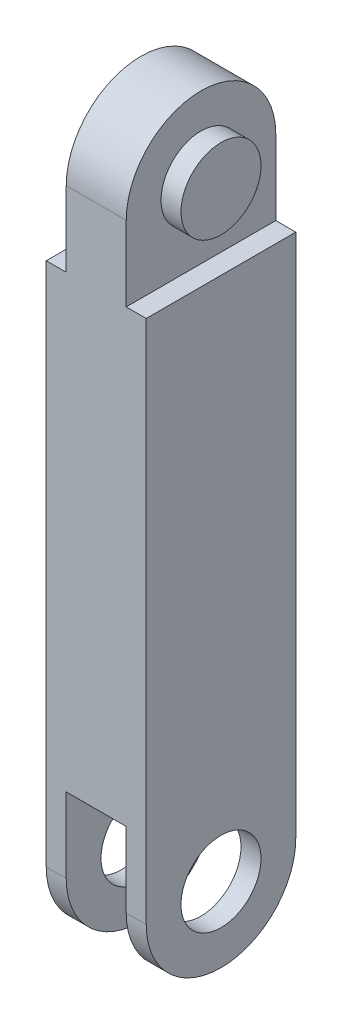
ISO-10303-21;
HEADER;
FILE_DESCRIPTION(('STEP AP214'),'2;1');
FILE_NAME('part.step','',(''),(''),'','','');
FILE_SCHEMA(('AUTOMOTIVE_DESIGN { 1 0 10303 214 1 1 1 1 }'));
ENDSEC;
DATA;
#1=APPLICATION_CONTEXT('core data for automotive mechanical design processes');
#2=APPLICATION_PROTOCOL_DEFINITION('international standard','automotive_design',2000,#1);
#3=PRODUCT_CONTEXT('',#1,'mechanical');
#4=PRODUCT('Part','Part','',(#3));
#5=PRODUCT_RELATED_PRODUCT_CATEGORY('part','',(#4));
#6=PRODUCT_DEFINITION_FORMATION('','',#4);
#7=PRODUCT_DEFINITION_CONTEXT('part definition',#1,'design');
#8=PRODUCT_DEFINITION('design','',#6,#7);
#9=PRODUCT_DEFINITION_SHAPE('','',#8);
#10=(LENGTH_UNIT() NAMED_UNIT(*) SI_UNIT(.MILLI.,.METRE.));
#11=(NAMED_UNIT(*) PLANE_ANGLE_UNIT() SI_UNIT($,.RADIAN.));
#12=(NAMED_UNIT(*) SI_UNIT($,.STERADIAN.) SOLID_ANGLE_UNIT());
#13=UNCERTAINTY_MEASURE_WITH_UNIT(LENGTH_MEASURE(1.E-05),#10,'distance_accuracy_value','');
#14=(GEOMETRIC_REPRESENTATION_CONTEXT(3) GLOBAL_UNCERTAINTY_ASSIGNED_CONTEXT((#13)) GLOBAL_UNIT_ASSIGNED_CONTEXT((#10,
#11,#12)) REPRESENTATION_CONTEXT('',''));
#15=CARTESIAN_POINT('',(0.,0.,0.));
#16=DIRECTION('',(0.,0.,1.));
#17=DIRECTION('',(1.,0.,0.));
#18=AXIS2_PLACEMENT_3D('',#15,#16,#17);
#19=CARTESIAN_POINT('',(100.,0.,0.));
#20=DIRECTION('',(-1.,0.,0.));
#21=DIRECTION('',(0.,0.,1.));
#22=AXIS2_PLACEMENT_3D('',#19,#20,#21);
#23=CYLINDRICAL_SURFACE('',#22,74.7678036336063);
#24=CARTESIAN_POINT('',(20.,0.,0.));
#25=DIRECTION('',(1.,0.,0.));
#26=DIRECTION('',(0.,0.,-1.));
#27=AXIS2_PLACEMENT_3D('',#24,#25,#26);
#28=CIRCLE('',#27,74.7678036336063);
#29=CARTESIAN_POINT('',(20.,0.,74.7678036336063));
#30=VERTEX_POINT('',#29);
#31=CARTESIAN_POINT('',(20.,0.,-74.7678036336063));
#32=VERTEX_POINT('',#31);
#33=EDGE_CURVE('E150',#30,#32,#28,.T.);
#34=ORIENTED_EDGE('',*,*,#33,.F.);
#35=DIRECTION('',(-1.,0.,0.));
#36=VECTOR('',#35,1.);
#37=CARTESIAN_POINT('',(100.,0.,74.7678036336063));
#38=LINE('',#37,#36);
#39=CARTESIAN_POINT('',(0.,0.,74.7678036336063));
#40=VERTEX_POINT('',#39);
#41=EDGE_CURVE('E217',#30,#40,#38,.T.);
#42=ORIENTED_EDGE('',*,*,#41,.T.);
#43=CARTESIAN_POINT('',(0.,0.,0.));
#44=DIRECTION('',(1.,0.,0.));
#45=DIRECTION('',(0.,0.,-1.));
#46=AXIS2_PLACEMENT_3D('',#43,#44,#45);
#47=CIRCLE('',#46,74.7678036336063);
#48=CARTESIAN_POINT('',(0.,0.,-74.7678036336063));
#49=VERTEX_POINT('',#48);
#50=EDGE_CURVE('E205',#40,#49,#47,.T.);
#51=ORIENTED_EDGE('',*,*,#50,.T.);
#52=DIRECTION('',(-1.,0.,0.));
#53=VECTOR('',#52,1.);
#54=CARTESIAN_POINT('',(100.,0.,-74.7678036336063));
#55=LINE('',#54,#53);
#56=EDGE_CURVE('E231',#32,#49,#55,.T.);
#57=ORIENTED_EDGE('',*,*,#56,.F.);
#58=EDGE_LOOP('',(#34,#42,#51,#57));
#59=FACE_BOUND('',#58,.T.);
#60=ADVANCED_FACE('F32',(#59),#23,.T.);
#61=CARTESIAN_POINT('',(285.,0.,0.));
#62=DIRECTION('',(-1.,0.,0.));
#63=DIRECTION('',(0.,0.,1.));
#64=AXIS2_PLACEMENT_3D('',#61,#62,#63);
#65=CYLINDRICAL_SURFACE('',#64,40.);
#66=CARTESIAN_POINT('',(0.,0.,0.));
#67=DIRECTION('',(-1.,0.,0.));
#68=DIRECTION('',(0.,0.,1.));
#69=AXIS2_PLACEMENT_3D('',#66,#67,#68);
#70=CIRCLE('',#69,40.);
#71=CARTESIAN_POINT('',(0.,0.,40.));
#72=VERTEX_POINT('',#71);
#73=EDGE_CURVE('E158',#72,#72,#70,.T.);
#74=ORIENTED_EDGE('',*,*,#73,.T.);
#75=EDGE_LOOP('',(#74));
#76=FACE_BOUND('',#75,.T.);
#77=CARTESIAN_POINT('',(20.,0.,0.));
#78=DIRECTION('',(1.,0.,0.));
#79=DIRECTION('',(0.,0.,-1.));
#80=AXIS2_PLACEMENT_3D('',#77,#78,#79);
#81=CIRCLE('',#80,40.);
#82=CARTESIAN_POINT('',(20.,0.,-40.));
#83=VERTEX_POINT('',#82);
#84=EDGE_CURVE('E148',#83,#83,#81,.F.);
#85=ORIENTED_EDGE('',*,*,#84,.F.);
#86=EDGE_LOOP('',(#85));
#87=FACE_BOUND('',#86,.T.);
#88=ADVANCED_FACE('F241',(#76,#87),#65,.F.);
#89=CARTESIAN_POINT('',(20.,600.,0.));
#90=DIRECTION('',(1.,0.,0.));
#91=DIRECTION('',(0.,0.,-1.));
#92=AXIS2_PLACEMENT_3D('',#89,#90,#91);
#93=PLANE('',#92);
#94=CARTESIAN_POINT('',(20.,600.,0.));
#95=DIRECTION('',(-1.,0.,0.));
#96=DIRECTION('',(0.,0.,-1.));
#97=AXIS2_PLACEMENT_3D('',#94,#95,#96);
#98=CIRCLE('',#97,74.7678036336063);
#99=CARTESIAN_POINT('',(20.,600.,74.7678036336063));
#100=VERTEX_POINT('',#99);
#101=CARTESIAN_POINT('',(20.,599.999999999999,-74.7678036336063));
#102=VERTEX_POINT('',#101);
#103=EDGE_CURVE('E188',#100,#102,#98,.T.);
#104=ORIENTED_EDGE('',*,*,#103,.T.);
#105=DIRECTION('',(0.,-1.,0.));
#106=VECTOR('',#105,1.);
#107=CARTESIAN_POINT('',(20.,599.999999999999,-74.7678036336063));
#108=LINE('',#107,#106);
#109=CARTESIAN_POINT('',(20.,524.999999999999,-74.7678036336063));
#110=VERTEX_POINT('',#109);
#111=EDGE_CURVE('E191',#102,#110,#108,.T.);
#112=ORIENTED_EDGE('',*,*,#111,.T.);
#113=DIRECTION('',(0.,0.,1.));
#114=VECTOR('',#113,1.);
#115=CARTESIAN_POINT('',(20.,525.,74.7678036336063));
#116=LINE('',#115,#114);
#117=CARTESIAN_POINT('',(20.,525.,74.7678036336063));
#118=VERTEX_POINT('',#117);
#119=EDGE_CURVE('E194',#110,#118,#116,.T.);
#120=ORIENTED_EDGE('',*,*,#119,.T.);
#121=DIRECTION('',(0.,1.,0.));
#122=VECTOR('',#121,1.);
#123=CARTESIAN_POINT('',(20.,600.,74.7678036336063));
#124=LINE('',#123,#122);
#125=EDGE_CURVE('E197',#118,#100,#124,.T.);
#126=ORIENTED_EDGE('',*,*,#125,.T.);
#127=EDGE_LOOP('',(#104,#112,#120,#126));
#128=FACE_BOUND('',#127,.T.);
#129=CARTESIAN_POINT('',(20.,600.,0.));
#130=DIRECTION('',(1.,0.,0.));
#131=DIRECTION('',(0.,0.,-1.));
#132=AXIS2_PLACEMENT_3D('',#129,#130,#131);
#133=CIRCLE('',#132,40.);
#134=CARTESIAN_POINT('',(20.,600.,-40.));
#135=VERTEX_POINT('',#134);
#136=EDGE_CURVE('E11',#135,#135,#133,.F.);
#137=ORIENTED_EDGE('',*,*,#136,.F.);
#138=EDGE_LOOP('',(#137));
#139=FACE_BOUND('',#138,.T.);
#140=ADVANCED_FACE('F243',(#128,#139),#93,.F.);
#141=CARTESIAN_POINT('',(80.,600.,0.));
#142=DIRECTION('',(-1.,0.,0.));
#143=DIRECTION('',(0.,0.,1.));
#144=AXIS2_PLACEMENT_3D('',#141,#142,#143);
#145=PLANE('',#144);
#146=DIRECTION('',(0.,-1.,0.));
#147=VECTOR('',#146,1.);
#148=CARTESIAN_POINT('',(80.,600.,-74.7678036336063));
#149=LINE('',#148,#147);
#150=CARTESIAN_POINT('',(80.,600.,-74.7678036336063));
#151=VERTEX_POINT('',#150);
#152=CARTESIAN_POINT('',(80.,525.,-74.7678036336063));
#153=VERTEX_POINT('',#152);
#154=EDGE_CURVE('E171',#151,#153,#149,.T.);
#155=ORIENTED_EDGE('',*,*,#154,.F.);
#156=CARTESIAN_POINT('',(80.,600.,0.));
#157=DIRECTION('',(-1.,0.,0.));
#158=DIRECTION('',(0.,0.,1.));
#159=AXIS2_PLACEMENT_3D('',#156,#157,#158);
#160=CIRCLE('',#159,74.7678036336063);
#161=CARTESIAN_POINT('',(80.,600.,74.7678036336063));
#162=VERTEX_POINT('',#161);
#163=EDGE_CURVE('E179',#162,#151,#160,.T.);
#164=ORIENTED_EDGE('',*,*,#163,.F.);
#165=DIRECTION('',(0.,-1.,0.));
#166=VECTOR('',#165,1.);
#167=CARTESIAN_POINT('',(80.,600.,74.7678036336063));
#168=LINE('',#167,#166);
#169=CARTESIAN_POINT('',(80.,525.,74.7678036336063));
#170=VERTEX_POINT('',#169);
#171=EDGE_CURVE('E176',#162,#170,#168,.T.);
#172=ORIENTED_EDGE('',*,*,#171,.T.);
#173=DIRECTION('',(0.,0.,1.));
#174=VECTOR('',#173,1.);
#175=CARTESIAN_POINT('',(80.,525.,-74.7678036336063));
#176=LINE('',#175,#174);
#177=EDGE_CURVE('E174',#153,#170,#176,.T.);
#178=ORIENTED_EDGE('',*,*,#177,.F.);
#179=EDGE_LOOP('',(#155,#164,#172,#178));
#180=FACE_BOUND('',#179,.T.);
#181=CARTESIAN_POINT('',(80.,600.,0.));
#182=DIRECTION('',(-1.,0.,0.));
#183=DIRECTION('',(0.,0.,1.));
#184=AXIS2_PLACEMENT_3D('',#181,#182,#183);
#185=CIRCLE('',#184,40.);
#186=CARTESIAN_POINT('',(80.,600.,40.));
#187=VERTEX_POINT('',#186);
#188=EDGE_CURVE('E41',#187,#187,#185,.F.);
#189=ORIENTED_EDGE('',*,*,#188,.F.);
#190=EDGE_LOOP('',(#189));
#191=FACE_BOUND('',#190,.T.);
#192=ADVANCED_FACE('F251',(#180,#191),#145,.F.);
#193=CARTESIAN_POINT('',(100.,0.,-74.7678036336063));
#194=DIRECTION('',(0.,0.,1.));
#195=DIRECTION('',(0.,-1.,0.));
#196=AXIS2_PLACEMENT_3D('',#193,#194,#195);
#197=PLANE('',#196);
#198=CARTESIAN_POINT('',(100.,0.,-74.7678036336063));
#199=VERTEX_POINT('',#198);
#200=CARTESIAN_POINT('',(80.,0.,-74.7678036336063));
#201=VERTEX_POINT('',#200);
#202=EDGE_CURVE('E232',#199,#201,#55,.T.);
#203=ORIENTED_EDGE('',*,*,#202,.T.);
#204=DIRECTION('',(0.,1.,0.));
#205=VECTOR('',#204,1.);
#206=CARTESIAN_POINT('',(80.,0.,-74.7678036336063));
#207=LINE('',#206,#205);
#208=CARTESIAN_POINT('',(80.,75.,-74.7678036336063));
#209=VERTEX_POINT('',#208);
#210=EDGE_CURVE('E155',#201,#209,#207,.T.);
#211=ORIENTED_EDGE('',*,*,#210,.T.);
#212=DIRECTION('',(-1.,0.,0.));
#213=VECTOR('',#212,1.);
#214=CARTESIAN_POINT('',(100.,75.,-74.7678036336063));
#215=LINE('',#214,#213);
#216=CARTESIAN_POINT('',(20.,75.,-74.7678036336063));
#217=VERTEX_POINT('',#216);
#218=EDGE_CURVE('E130',#209,#217,#215,.T.);
#219=ORIENTED_EDGE('',*,*,#218,.T.);
#220=DIRECTION('',(0.,1.,0.));
#221=VECTOR('',#220,1.);
#222=CARTESIAN_POINT('',(20.,0.,-74.7678036336063));
#223=LINE('',#222,#221);
#224=EDGE_CURVE('E152',#32,#217,#223,.T.);
#225=ORIENTED_EDGE('',*,*,#224,.F.);
#226=ORIENTED_EDGE('',*,*,#56,.T.);
#227=DIRECTION('',(0.,1.,0.));
#228=VECTOR('',#227,1.);
#229=CARTESIAN_POINT('',(0.,0.,-74.7678036336063));
#230=LINE('',#229,#228);
#231=CARTESIAN_POINT('',(0.,524.999999999999,-74.7678036336063));
#232=VERTEX_POINT('',#231);
#233=EDGE_CURVE('E220',#49,#232,#230,.T.);
#234=ORIENTED_EDGE('',*,*,#233,.T.);
#235=DIRECTION('',(-1.,0.,0.));
#236=VECTOR('',#235,1.);
#237=CARTESIAN_POINT('',(20.,524.999999999999,-74.7678036336063));
#238=LINE('',#237,#236);
#239=EDGE_CURVE('E200',#110,#232,#238,.T.);
#240=ORIENTED_EDGE('',*,*,#239,.F.);
#241=ORIENTED_EDGE('',*,*,#111,.F.);
#242=DIRECTION('',(-1.,0.,0.));
#243=VECTOR('',#242,1.);
#244=CARTESIAN_POINT('',(100.,599.999999999999,-74.7678036336063));
#245=LINE('',#244,#243);
#246=EDGE_CURVE('E229',#151,#102,#245,.T.);
#247=ORIENTED_EDGE('',*,*,#246,.F.);
#248=ORIENTED_EDGE('',*,*,#154,.T.);
#249=DIRECTION('',(1.,0.,0.));
#250=VECTOR('',#249,1.);
#251=CARTESIAN_POINT('',(80.,525.,-74.7678036336063));
#252=LINE('',#251,#250);
#253=CARTESIAN_POINT('',(100.,525.,-74.7678036336063));
#254=VERTEX_POINT('',#253);
#255=EDGE_CURVE('E184',#153,#254,#252,.T.);
#256=ORIENTED_EDGE('',*,*,#255,.T.);
#257=DIRECTION('',(0.,1.,0.));
#258=VECTOR('',#257,1.);
#259=CARTESIAN_POINT('',(100.,0.,-74.7678036336063));
#260=LINE('',#259,#258);
#261=EDGE_CURVE('E210',#199,#254,#260,.T.);
#262=ORIENTED_EDGE('',*,*,#261,.F.);
#263=EDGE_LOOP('',(#203,#211,#219,#225,#226,#234,#240,#241,#247,#248,#256,#262));
#264=FACE_BOUND('',#263,.T.);
#265=ADVANCED_FACE('F280',(#264),#197,.F.);
#266=CARTESIAN_POINT('',(100.,0.,74.7678036336063));
#267=DIRECTION('',(0.,0.,1.));
#268=DIRECTION('',(1.,0.,0.));
#269=AXIS2_PLACEMENT_3D('',#266,#267,#268);
#270=PLANE('',#269);
#271=DIRECTION('',(0.,1.,0.));
#272=VECTOR('',#271,1.);
#273=CARTESIAN_POINT('',(80.,-75.,74.7678036336063));
#274=LINE('',#273,#272);
#275=CARTESIAN_POINT('',(80.,0.,74.7678036336063));
#276=VERTEX_POINT('',#275);
#277=CARTESIAN_POINT('',(80.,75.,74.7678036336063));
#278=VERTEX_POINT('',#277);
#279=EDGE_CURVE('E136',#276,#278,#274,.T.);
#280=ORIENTED_EDGE('',*,*,#279,.F.);
#281=CARTESIAN_POINT('',(100.,0.,74.7678036336063));
#282=VERTEX_POINT('',#281);
#283=EDGE_CURVE('E225',#282,#276,#38,.T.);
#284=ORIENTED_EDGE('',*,*,#283,.F.);
#285=DIRECTION('',(0.,1.,0.));
#286=VECTOR('',#285,1.);
#287=CARTESIAN_POINT('',(100.,0.,74.7678036336063));
#288=LINE('',#287,#286);
#289=CARTESIAN_POINT('',(100.,525.,74.7678036336063));
#290=VERTEX_POINT('',#289);
#291=EDGE_CURVE('E214',#282,#290,#288,.T.);
#292=ORIENTED_EDGE('',*,*,#291,.T.);
#293=DIRECTION('',(1.,0.,0.));
#294=VECTOR('',#293,1.);
#295=CARTESIAN_POINT('',(80.,525.,74.7678036336063));
#296=LINE('',#295,#294);
#297=EDGE_CURVE('E57',#170,#290,#296,.T.);
#298=ORIENTED_EDGE('',*,*,#297,.F.);
#299=ORIENTED_EDGE('',*,*,#171,.F.);
#300=DIRECTION('',(-1.,0.,0.));
#301=VECTOR('',#300,1.);
#302=CARTESIAN_POINT('',(100.,600.,74.7678036336063));
#303=LINE('',#302,#301);
#304=EDGE_CURVE('E227',#162,#100,#303,.T.);
#305=ORIENTED_EDGE('',*,*,#304,.T.);
#306=ORIENTED_EDGE('',*,*,#125,.F.);
#307=DIRECTION('',(-1.,0.,0.));
#308=VECTOR('',#307,1.);
#309=CARTESIAN_POINT('',(20.,525.,74.7678036336063));
#310=LINE('',#309,#308);
#311=CARTESIAN_POINT('',(0.,525.,74.7678036336063));
#312=VERTEX_POINT('',#311);
#313=EDGE_CURVE('E202',#118,#312,#310,.T.);
#314=ORIENTED_EDGE('',*,*,#313,.T.);
#315=DIRECTION('',(0.,1.,0.));
#316=VECTOR('',#315,1.);
#317=CARTESIAN_POINT('',(0.,0.,74.7678036336063));
#318=LINE('',#317,#316);
#319=EDGE_CURVE('E211',#40,#312,#318,.T.);
#320=ORIENTED_EDGE('',*,*,#319,.F.);
#321=ORIENTED_EDGE('',*,*,#41,.F.);
#322=DIRECTION('',(0.,1.,0.));
#323=VECTOR('',#322,1.);
#324=CARTESIAN_POINT('',(20.,-75.,74.7678036336063));
#325=LINE('',#324,#323);
#326=CARTESIAN_POINT('',(20.,75.,74.7678036336063));
#327=VERTEX_POINT('',#326);
#328=EDGE_CURVE('E49',#30,#327,#325,.T.);
#329=ORIENTED_EDGE('',*,*,#328,.T.);
#330=DIRECTION('',(-1.,0.,0.));
#331=VECTOR('',#330,1.);
#332=CARTESIAN_POINT('',(80.,75.,74.7678036336063));
#333=LINE('',#332,#331);
#334=EDGE_CURVE('E128',#278,#327,#333,.T.);
#335=ORIENTED_EDGE('',*,*,#334,.F.);
#336=EDGE_LOOP('',(#280,#284,#292,#298,#299,#305,#306,#314,#320,#321,#329,#335));
#337=FACE_BOUND('',#336,.T.);
#338=ADVANCED_FACE('F143',(#337),#270,.T.);
#339=CARTESIAN_POINT('',(100.,0.,0.));
#340=DIRECTION('',(1.,0.,0.));
#341=DIRECTION('',(0.,0.,-1.));
#342=AXIS2_PLACEMENT_3D('',#339,#340,#341);
#343=PLANE('',#342);
#344=CARTESIAN_POINT('',(100.,0.,0.));
#345=DIRECTION('',(1.,0.,0.));
#346=DIRECTION('',(0.,0.,-1.));
#347=AXIS2_PLACEMENT_3D('',#344,#345,#346);
#348=CIRCLE('',#347,40.);
#349=CARTESIAN_POINT('',(100.,0.,-40.));
#350=VERTEX_POINT('',#349);
#351=EDGE_CURVE('E161',#350,#350,#348,.T.);
#352=ORIENTED_EDGE('',*,*,#351,.F.);
#353=EDGE_LOOP('',(#352));
#354=FACE_BOUND('',#353,.T.);
#355=ORIENTED_EDGE('',*,*,#261,.T.);
#356=DIRECTION('',(0.,0.,1.));
#357=VECTOR('',#356,1.);
#358=CARTESIAN_POINT('',(100.,525.,-74.7678036336063));
#359=LINE('',#358,#357);
#360=EDGE_CURVE('E170',#254,#290,#359,.T.);
#361=ORIENTED_EDGE('',*,*,#360,.T.);
#362=ORIENTED_EDGE('',*,*,#291,.F.);
#363=CARTESIAN_POINT('',(100.,0.,0.));
#364=DIRECTION('',(1.,0.,0.));
#365=DIRECTION('',(0.,0.,-1.));
#366=AXIS2_PLACEMENT_3D('',#363,#364,#365);
#367=CIRCLE('',#366,74.7678036336063);
#368=EDGE_CURVE('E207',#282,#199,#367,.T.);
#369=ORIENTED_EDGE('',*,*,#368,.T.);
#370=EDGE_LOOP('',(#355,#361,#362,#369));
#371=FACE_BOUND('',#370,.T.);
#372=ADVANCED_FACE('F272',(#354,#371),#343,.T.);
#373=ORIENTED_EDGE('',*,*,#283,.T.);
#374=CARTESIAN_POINT('',(80.,0.,0.));
#375=DIRECTION('',(1.,0.,0.));
#376=DIRECTION('',(0.,0.,-1.));
#377=AXIS2_PLACEMENT_3D('',#374,#375,#376);
#378=CIRCLE('',#377,74.7678036336063);
#379=EDGE_CURVE('E139',#276,#201,#378,.T.);
#380=ORIENTED_EDGE('',*,*,#379,.T.);
#381=ORIENTED_EDGE('',*,*,#202,.F.);
#382=ORIENTED_EDGE('',*,*,#368,.F.);
#383=EDGE_LOOP('',(#373,#380,#381,#382));
#384=FACE_BOUND('',#383,.T.);
#385=ADVANCED_FACE('F34',(#384),#23,.T.);
#386=CARTESIAN_POINT('',(100.,600.,0.));
#387=DIRECTION('',(-1.,0.,0.));
#388=DIRECTION('',(0.,0.,1.));
#389=AXIS2_PLACEMENT_3D('',#386,#387,#388);
#390=CYLINDRICAL_SURFACE('',#389,74.7678036336063);
#391=ORIENTED_EDGE('',*,*,#163,.T.);
#392=ORIENTED_EDGE('',*,*,#246,.T.);
#393=ORIENTED_EDGE('',*,*,#103,.F.);
#394=ORIENTED_EDGE('',*,*,#304,.F.);
#395=EDGE_LOOP('',(#391,#392,#393,#394));
#396=FACE_BOUND('',#395,.T.);
#397=ADVANCED_FACE('F290',(#396),#390,.T.);
#398=CARTESIAN_POINT('',(0.,0.,0.));
#399=DIRECTION('',(1.,0.,0.));
#400=DIRECTION('',(0.,0.,-1.));
#401=AXIS2_PLACEMENT_3D('',#398,#399,#400);
#402=PLANE('',#401);
#403=ORIENTED_EDGE('',*,*,#73,.F.);
#404=EDGE_LOOP('',(#403));
#405=FACE_BOUND('',#404,.T.);
#406=ORIENTED_EDGE('',*,*,#319,.T.);
#407=DIRECTION('',(0.,0.,1.));
#408=VECTOR('',#407,1.);
#409=CARTESIAN_POINT('',(0.,525.,74.7678036336063));
#410=LINE('',#409,#408);
#411=EDGE_CURVE('E187',#232,#312,#410,.T.);
#412=ORIENTED_EDGE('',*,*,#411,.F.);
#413=ORIENTED_EDGE('',*,*,#233,.F.);
#414=ORIENTED_EDGE('',*,*,#50,.F.);
#415=EDGE_LOOP('',(#406,#412,#413,#414));
#416=FACE_BOUND('',#415,.T.);
#417=ADVANCED_FACE('F294',(#405,#416),#402,.F.);
#418=CARTESIAN_POINT('',(20.,525.,74.7678036336063));
#419=DIRECTION('',(0.,-1.,0.));
#420=DIRECTION('',(0.,0.,-1.));
#421=AXIS2_PLACEMENT_3D('',#418,#419,#420);
#422=PLANE('',#421);
#423=ORIENTED_EDGE('',*,*,#411,.T.);
#424=ORIENTED_EDGE('',*,*,#313,.F.);
#425=ORIENTED_EDGE('',*,*,#119,.F.);
#426=ORIENTED_EDGE('',*,*,#239,.T.);
#427=EDGE_LOOP('',(#423,#424,#425,#426));
#428=FACE_BOUND('',#427,.T.);
#429=ADVANCED_FACE('F300',(#428),#422,.F.);
#430=CARTESIAN_POINT('',(80.,525.,-74.7678036336063));
#431=DIRECTION('',(0.,1.,0.));
#432=DIRECTION('',(0.,0.,1.));
#433=AXIS2_PLACEMENT_3D('',#430,#431,#432);
#434=PLANE('',#433);
#435=ORIENTED_EDGE('',*,*,#360,.F.);
#436=ORIENTED_EDGE('',*,*,#255,.F.);
#437=ORIENTED_EDGE('',*,*,#177,.T.);
#438=ORIENTED_EDGE('',*,*,#297,.T.);
#439=EDGE_LOOP('',(#435,#436,#437,#438));
#440=FACE_BOUND('',#439,.T.);
#441=ADVANCED_FACE('F283',(#440),#434,.T.);
#442=CARTESIAN_POINT('',(100.,600.,0.));
#443=DIRECTION('',(-1.,0.,0.));
#444=DIRECTION('',(0.,0.,1.));
#445=AXIS2_PLACEMENT_3D('',#442,#443,#444);
#446=CYLINDRICAL_SURFACE('',#445,40.);
#447=CARTESIAN_POINT('',(100.,600.,0.));
#448=DIRECTION('',(1.,0.,0.));
#449=DIRECTION('',(0.,0.,-1.));
#450=AXIS2_PLACEMENT_3D('',#447,#448,#449);
#451=CIRCLE('',#450,40.);
#452=CARTESIAN_POINT('',(100.,600.,-40.));
#453=VERTEX_POINT('',#452);
#454=EDGE_CURVE('E167',#453,#453,#451,.T.);
#455=ORIENTED_EDGE('',*,*,#454,.F.);
#456=EDGE_LOOP('',(#455));
#457=FACE_BOUND('',#456,.T.);
#458=ORIENTED_EDGE('',*,*,#188,.T.);
#459=EDGE_LOOP('',(#458));
#460=FACE_BOUND('',#459,.T.);
#461=ADVANCED_FACE('F314',(#457,#460),#446,.T.);
#462=CARTESIAN_POINT('',(100.,600.,0.));
#463=DIRECTION('',(1.,0.,0.));
#464=DIRECTION('',(0.,0.,-1.));
#465=AXIS2_PLACEMENT_3D('',#462,#463,#464);
#466=PLANE('',#465);
#467=ORIENTED_EDGE('',*,*,#454,.T.);
#468=EDGE_LOOP('',(#467));
#469=FACE_BOUND('',#468,.T.);
#470=ADVANCED_FACE('F337',(#469),#466,.T.);
#471=CARTESIAN_POINT('',(0.,600.,0.));
#472=DIRECTION('',(1.,0.,0.));
#473=DIRECTION('',(0.,0.,-1.));
#474=AXIS2_PLACEMENT_3D('',#471,#472,#473);
#475=CYLINDRICAL_SURFACE('',#474,40.);
#476=CARTESIAN_POINT('',(0.,600.,0.));
#477=DIRECTION('',(-1.,0.,0.));
#478=DIRECTION('',(0.,0.,1.));
#479=AXIS2_PLACEMENT_3D('',#476,#477,#478);
#480=CIRCLE('',#479,40.);
#481=CARTESIAN_POINT('',(0.,600.,40.));
#482=VERTEX_POINT('',#481);
#483=EDGE_CURVE('E164',#482,#482,#480,.T.);
#484=ORIENTED_EDGE('',*,*,#483,.F.);
#485=EDGE_LOOP('',(#484));
#486=FACE_BOUND('',#485,.T.);
#487=ORIENTED_EDGE('',*,*,#136,.T.);
#488=EDGE_LOOP('',(#487));
#489=FACE_BOUND('',#488,.T.);
#490=ADVANCED_FACE('F265',(#486,#489),#475,.T.);
#491=CARTESIAN_POINT('',(0.,600.,0.));
#492=DIRECTION('',(-1.,0.,0.));
#493=DIRECTION('',(0.,0.,1.));
#494=AXIS2_PLACEMENT_3D('',#491,#492,#493);
#495=PLANE('',#494);
#496=ORIENTED_EDGE('',*,*,#483,.T.);
#497=EDGE_LOOP('',(#496));
#498=FACE_BOUND('',#497,.T.);
#499=ADVANCED_FACE('F258',(#498),#495,.T.);
#500=CARTESIAN_POINT('',(80.,0.,0.));
#501=DIRECTION('',(1.,0.,0.));
#502=DIRECTION('',(0.,0.,-1.));
#503=AXIS2_PLACEMENT_3D('',#500,#501,#502);
#504=CIRCLE('',#503,40.);
#505=CARTESIAN_POINT('',(80.,0.,-40.));
#506=VERTEX_POINT('',#505);
#507=EDGE_CURVE('E36',#506,#506,#504,.F.);
#508=ORIENTED_EDGE('',*,*,#507,.T.);
#509=EDGE_LOOP('',(#508));
#510=FACE_BOUND('',#509,.T.);
#511=ORIENTED_EDGE('',*,*,#351,.T.);
#512=EDGE_LOOP('',(#511));
#513=FACE_BOUND('',#512,.T.);
#514=ADVANCED_FACE('F246',(#510,#513),#65,.F.);
#515=CARTESIAN_POINT('',(80.,75.,-210.232196366394));
#516=DIRECTION('',(0.,1.,0.));
#517=DIRECTION('',(0.,0.,1.));
#518=AXIS2_PLACEMENT_3D('',#515,#516,#517);
#519=PLANE('',#518);
#520=DIRECTION('',(0.,0.,1.));
#521=VECTOR('',#520,1.);
#522=CARTESIAN_POINT('',(80.,75.,-210.232196366394));
#523=LINE('',#522,#521);
#524=EDGE_CURVE('E123',#209,#278,#523,.T.);
#525=ORIENTED_EDGE('',*,*,#524,.T.);
#526=ORIENTED_EDGE('',*,*,#334,.T.);
#527=DIRECTION('',(0.,0.,1.));
#528=VECTOR('',#527,1.);
#529=CARTESIAN_POINT('',(20.,75.,-210.232196366394));
#530=LINE('',#529,#528);
#531=EDGE_CURVE('E133',#217,#327,#530,.T.);
#532=ORIENTED_EDGE('',*,*,#531,.F.);
#533=ORIENTED_EDGE('',*,*,#218,.F.);
#534=EDGE_LOOP('',(#525,#526,#532,#533));
#535=FACE_BOUND('',#534,.T.);
#536=ADVANCED_FACE('F125',(#535),#519,.F.);
#537=CARTESIAN_POINT('',(80.,-75.,-210.232196366394));
#538=DIRECTION('',(1.,0.,0.));
#539=DIRECTION('',(0.,0.,-1.));
#540=AXIS2_PLACEMENT_3D('',#537,#538,#539);
#541=PLANE('',#540);
#542=ORIENTED_EDGE('',*,*,#507,.F.);
#543=EDGE_LOOP('',(#542));
#544=FACE_BOUND('',#543,.T.);
#545=ORIENTED_EDGE('',*,*,#379,.F.);
#546=ORIENTED_EDGE('',*,*,#279,.T.);
#547=ORIENTED_EDGE('',*,*,#524,.F.);
#548=ORIENTED_EDGE('',*,*,#210,.F.);
#549=EDGE_LOOP('',(#545,#546,#547,#548));
#550=FACE_BOUND('',#549,.T.);
#551=ADVANCED_FACE('F137',(#544,#550),#541,.F.);
#552=CARTESIAN_POINT('',(20.,-75.,-210.232196366394));
#553=DIRECTION('',(1.,0.,0.));
#554=DIRECTION('',(0.,0.,-1.));
#555=AXIS2_PLACEMENT_3D('',#552,#553,#554);
#556=PLANE('',#555);
#557=ORIENTED_EDGE('',*,*,#84,.T.);
#558=EDGE_LOOP('',(#557));
#559=FACE_BOUND('',#558,.T.);
#560=ORIENTED_EDGE('',*,*,#224,.T.);
#561=ORIENTED_EDGE('',*,*,#531,.T.);
#562=ORIENTED_EDGE('',*,*,#328,.F.);
#563=ORIENTED_EDGE('',*,*,#33,.T.);
#564=EDGE_LOOP('',(#560,#561,#562,#563));
#565=FACE_BOUND('',#564,.T.);
#566=ADVANCED_FACE('F239',(#559,#565),#556,.T.);
#567=CLOSED_SHELL('',(#60,#88,#140,#192,#265,#338,#372,#385,#397,#417,#429,#441,#461,#470,#490,
#499,#514,#536,#551,#566));
#568=MANIFOLD_SOLID_BREP('B2',#567);
#569=ADVANCED_BREP_SHAPE_REPRESENTATION('',(#18,#568),#14);
#570=SHAPE_DEFINITION_REPRESENTATION(#9,#569);
ENDSEC;
END-ISO-10303-21;
